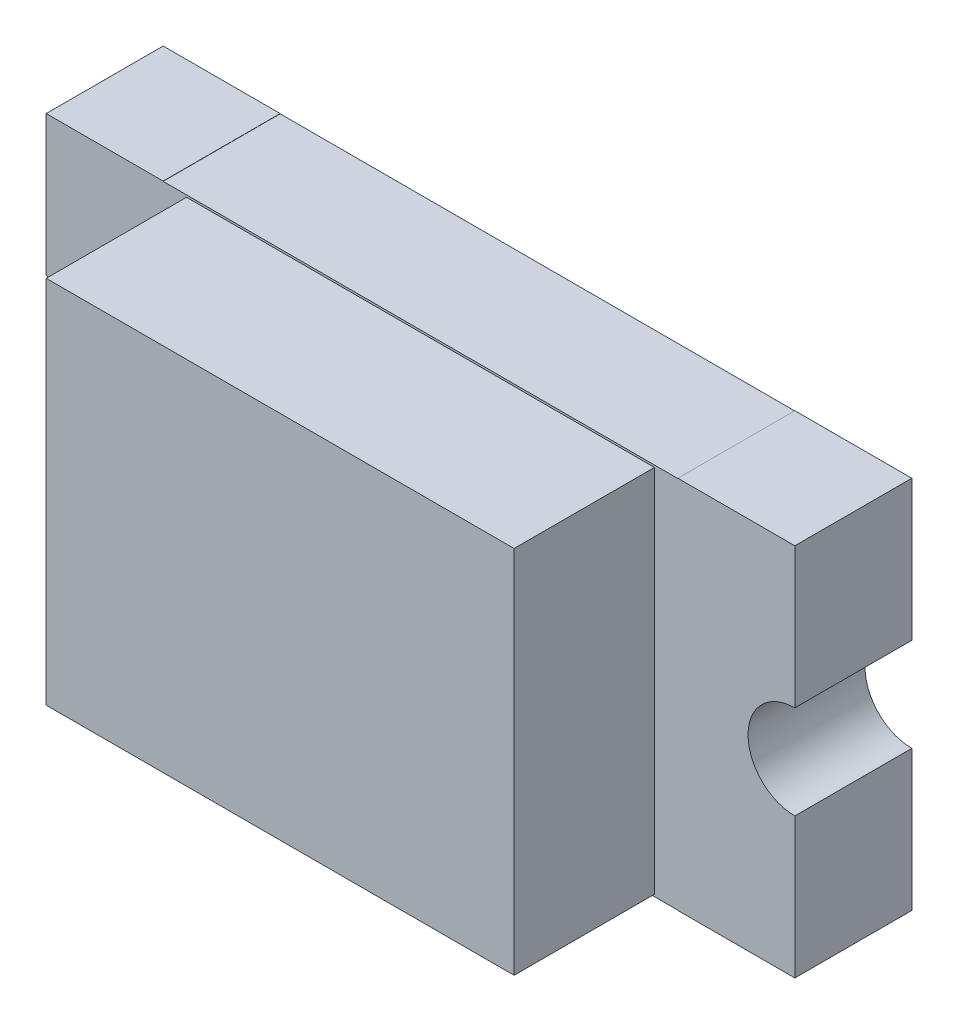
ISO-10303-21;
HEADER;
FILE_DESCRIPTION(('STEP AP214'),'2;1');
FILE_NAME('part.step','',(''),(''),'','','');
FILE_SCHEMA(('AUTOMOTIVE_DESIGN { 1 0 10303 214 1 1 1 1 }'));
ENDSEC;
DATA;
#1=APPLICATION_CONTEXT('core data for automotive mechanical design processes');
#2=APPLICATION_PROTOCOL_DEFINITION('international standard','automotive_design',2000,#1);
#3=PRODUCT_CONTEXT('',#1,'mechanical');
#4=PRODUCT('Part','Part','',(#3));
#5=PRODUCT_RELATED_PRODUCT_CATEGORY('part','',(#4));
#6=PRODUCT_DEFINITION_FORMATION('','',#4);
#7=PRODUCT_DEFINITION_CONTEXT('part definition',#1,'design');
#8=PRODUCT_DEFINITION('design','',#6,#7);
#9=PRODUCT_DEFINITION_SHAPE('','',#8);
#10=(LENGTH_UNIT() NAMED_UNIT(*) SI_UNIT(.MILLI.,.METRE.));
#11=(NAMED_UNIT(*) PLANE_ANGLE_UNIT() SI_UNIT($,.RADIAN.));
#12=(NAMED_UNIT(*) SI_UNIT($,.STERADIAN.) SOLID_ANGLE_UNIT());
#13=UNCERTAINTY_MEASURE_WITH_UNIT(LENGTH_MEASURE(1.E-05),#10,'distance_accuracy_value','');
#14=(GEOMETRIC_REPRESENTATION_CONTEXT(3) GLOBAL_UNCERTAINTY_ASSIGNED_CONTEXT((#13)) GLOBAL_UNIT_ASSIGNED_CONTEXT((#10,
#11,#12)) REPRESENTATION_CONTEXT('',''));
#15=CARTESIAN_POINT('',(0.,0.,0.));
#16=DIRECTION('',(0.,0.,1.));
#17=DIRECTION('',(1.,0.,0.));
#18=AXIS2_PLACEMENT_3D('',#15,#16,#17);
#19=CARTESIAN_POINT('',(0.,0.,1.1));
#20=DIRECTION('',(0.,0.,1.));
#21=DIRECTION('',(1.,0.,0.));
#22=AXIS2_PLACEMENT_3D('',#19,#20,#21);
#23=PLANE('',#22);
#24=DIRECTION('',(1.,0.,0.));
#25=VECTOR('',#24,1.);
#26=CARTESIAN_POINT('',(1.,0.79,1.1));
#27=LINE('',#26,#25);
#28=CARTESIAN_POINT('',(1.,0.79,1.1));
#29=VERTEX_POINT('',#28);
#30=CARTESIAN_POINT('',(-1.,0.79,1.1));
#31=VERTEX_POINT('',#30);
#32=EDGE_CURVE('E159',#29,#31,#27,.F.);
#33=ORIENTED_EDGE('',*,*,#32,.T.);
#34=DIRECTION('',(0.,1.,0.));
#35=VECTOR('',#34,1.);
#36=CARTESIAN_POINT('',(-1.,-0.79,1.1));
#37=LINE('',#36,#35);
#38=CARTESIAN_POINT('',(-1.,-0.79,1.1));
#39=VERTEX_POINT('',#38);
#40=EDGE_CURVE('E138',#31,#39,#37,.F.);
#41=ORIENTED_EDGE('',*,*,#40,.T.);
#42=DIRECTION('',(-1.,0.,0.));
#43=VECTOR('',#42,1.);
#44=CARTESIAN_POINT('',(-1.,-0.79,1.1));
#45=LINE('',#44,#43);
#46=CARTESIAN_POINT('',(1.,-0.79,1.1));
#47=VERTEX_POINT('',#46);
#48=EDGE_CURVE('E145',#39,#47,#45,.F.);
#49=ORIENTED_EDGE('',*,*,#48,.T.);
#50=DIRECTION('',(0.,1.,0.));
#51=VECTOR('',#50,1.);
#52=CARTESIAN_POINT('',(1.,0.,1.1));
#53=LINE('',#52,#51);
#54=EDGE_CURVE('E154',#47,#29,#53,.T.);
#55=ORIENTED_EDGE('',*,*,#54,.T.);
#56=EDGE_LOOP('',(#33,#41,#49,#55));
#57=FACE_BOUND('',#56,.T.);
#58=ADVANCED_FACE('F17',(#57),#23,.T.);
#59=CARTESIAN_POINT('',(-1.,-0.79,1.1));
#60=DIRECTION('',(0.,1.,0.));
#61=DIRECTION('',(-1.,0.,0.));
#62=AXIS2_PLACEMENT_3D('',#59,#60,#61);
#63=PLANE('',#62);
#64=ORIENTED_EDGE('',*,*,#48,.F.);
#65=DIRECTION('',(0.,0.,1.));
#66=VECTOR('',#65,1.);
#67=CARTESIAN_POINT('',(-1.,-0.79,1.1));
#68=LINE('',#67,#66);
#69=CARTESIAN_POINT('',(-1.,-0.79,0.5));
#70=VERTEX_POINT('',#69);
#71=EDGE_CURVE('E149',#39,#70,#68,.F.);
#72=ORIENTED_EDGE('',*,*,#71,.T.);
#73=DIRECTION('',(1.,0.,0.));
#74=VECTOR('',#73,1.);
#75=CARTESIAN_POINT('',(0.,-0.79,0.5));
#76=LINE('',#75,#74);
#77=CARTESIAN_POINT('',(1.,-0.79,0.5));
#78=VERTEX_POINT('',#77);
#79=EDGE_CURVE('E234',#78,#70,#76,.F.);
#80=ORIENTED_EDGE('',*,*,#79,.F.);
#81=DIRECTION('',(0.,0.,1.));
#82=VECTOR('',#81,1.);
#83=CARTESIAN_POINT('',(1.,-0.79,1.1));
#84=LINE('',#83,#82);
#85=EDGE_CURVE('E152',#78,#47,#84,.T.);
#86=ORIENTED_EDGE('',*,*,#85,.T.);
#87=EDGE_LOOP('',(#64,#72,#80,#86));
#88=FACE_BOUND('',#87,.T.);
#89=ADVANCED_FACE('F146',(#88),#63,.F.);
#90=CARTESIAN_POINT('',(-1.,-0.79,1.1));
#91=DIRECTION('',(1.,0.,0.));
#92=DIRECTION('',(0.,1.,0.));
#93=AXIS2_PLACEMENT_3D('',#90,#91,#92);
#94=PLANE('',#93);
#95=ORIENTED_EDGE('',*,*,#40,.F.);
#96=DIRECTION('',(0.,0.,1.));
#97=VECTOR('',#96,1.);
#98=CARTESIAN_POINT('',(-1.,0.79,1.1));
#99=LINE('',#98,#97);
#100=CARTESIAN_POINT('',(-1.,0.79,0.5));
#101=VERTEX_POINT('',#100);
#102=EDGE_CURVE('E264',#31,#101,#99,.F.);
#103=ORIENTED_EDGE('',*,*,#102,.T.);
#104=DIRECTION('',(0.,1.,0.));
#105=VECTOR('',#104,1.);
#106=CARTESIAN_POINT('',(-1.,0.,0.5));
#107=LINE('',#106,#105);
#108=EDGE_CURVE('E158',#70,#101,#107,.T.);
#109=ORIENTED_EDGE('',*,*,#108,.F.);
#110=ORIENTED_EDGE('',*,*,#71,.F.);
#111=EDGE_LOOP('',(#95,#103,#109,#110));
#112=FACE_BOUND('',#111,.T.);
#113=ADVANCED_FACE('F156',(#112),#94,.F.);
#114=CARTESIAN_POINT('',(1.,0.79,1.1));
#115=DIRECTION('',(0.,-1.,0.));
#116=DIRECTION('',(1.,0.,0.));
#117=AXIS2_PLACEMENT_3D('',#114,#115,#116);
#118=PLANE('',#117);
#119=ORIENTED_EDGE('',*,*,#32,.F.);
#120=DIRECTION('',(0.,0.,1.));
#121=VECTOR('',#120,1.);
#122=CARTESIAN_POINT('',(1.,0.79,1.1));
#123=LINE('',#122,#121);
#124=CARTESIAN_POINT('',(1.,0.79,0.5));
#125=VERTEX_POINT('',#124);
#126=EDGE_CURVE('E237',#29,#125,#123,.F.);
#127=ORIENTED_EDGE('',*,*,#126,.T.);
#128=DIRECTION('',(1.,0.,0.));
#129=VECTOR('',#128,1.);
#130=CARTESIAN_POINT('',(0.,0.79,0.5));
#131=LINE('',#130,#129);
#132=EDGE_CURVE('E231',#101,#125,#131,.T.);
#133=ORIENTED_EDGE('',*,*,#132,.F.);
#134=ORIENTED_EDGE('',*,*,#102,.F.);
#135=EDGE_LOOP('',(#119,#127,#133,#134));
#136=FACE_BOUND('',#135,.T.);
#137=ADVANCED_FACE('F268',(#136),#118,.F.);
#138=CARTESIAN_POINT('',(1.,0.79,1.1));
#139=DIRECTION('',(-1.,0.,0.));
#140=DIRECTION('',(0.,0.,1.));
#141=AXIS2_PLACEMENT_3D('',#138,#139,#140);
#142=PLANE('',#141);
#143=ORIENTED_EDGE('',*,*,#54,.F.);
#144=ORIENTED_EDGE('',*,*,#85,.F.);
#145=DIRECTION('',(0.,1.,0.));
#146=VECTOR('',#145,1.);
#147=CARTESIAN_POINT('',(1.,0.,0.5));
#148=LINE('',#147,#146);
#149=EDGE_CURVE('E226',#125,#78,#148,.F.);
#150=ORIENTED_EDGE('',*,*,#149,.F.);
#151=ORIENTED_EDGE('',*,*,#126,.F.);
#152=EDGE_LOOP('',(#143,#144,#150,#151));
#153=FACE_BOUND('',#152,.T.);
#154=ADVANCED_FACE('F508',(#153),#142,.F.);
#155=CARTESIAN_POINT('',(0.,0.,0.5));
#156=DIRECTION('',(0.,0.,1.));
#157=DIRECTION('',(1.,0.,0.));
#158=AXIS2_PLACEMENT_3D('',#155,#156,#157);
#159=PLANE('',#158);
#160=DIRECTION('',(0.,1.,0.));
#161=VECTOR('',#160,1.);
#162=CARTESIAN_POINT('',(-1.1,0.,0.5));
#163=LINE('',#162,#161);
#164=CARTESIAN_POINT('',(-1.1,0.799,0.5));
#165=VERTEX_POINT('',#164);
#166=CARTESIAN_POINT('',(-1.1,0.8,0.5));
#167=VERTEX_POINT('',#166);
#168=EDGE_CURVE('E210',#165,#167,#163,.T.);
#169=ORIENTED_EDGE('',*,*,#168,.T.);
#170=DIRECTION('',(1.,0.,0.));
#171=VECTOR('',#170,1.);
#172=CARTESIAN_POINT('',(0.,0.8,0.5));
#173=LINE('',#172,#171);
#174=CARTESIAN_POINT('',(-1.6,0.8,0.5));
#175=VERTEX_POINT('',#174);
#176=EDGE_CURVE('E118',#167,#175,#173,.F.);
#177=ORIENTED_EDGE('',*,*,#176,.T.);
#178=DIRECTION('',(0.,1.,0.));
#179=VECTOR('',#178,1.);
#180=CARTESIAN_POINT('',(-1.6,0.,0.5));
#181=LINE('',#180,#179);
#182=CARTESIAN_POINT('',(-1.6,0.2,0.5));
#183=VERTEX_POINT('',#182);
#184=EDGE_CURVE('E219',#175,#183,#181,.F.);
#185=ORIENTED_EDGE('',*,*,#184,.T.);
#186=CARTESIAN_POINT('',(-1.6,0.,0.5));
#187=DIRECTION('',(0.,0.,1.));
#188=DIRECTION('',(1.,0.,0.));
#189=AXIS2_PLACEMENT_3D('',#186,#187,#188);
#190=CIRCLE('',#189,0.2);
#191=CARTESIAN_POINT('',(-1.6,-0.2,0.5));
#192=VERTEX_POINT('',#191);
#193=EDGE_CURVE('E20',#183,#192,#190,.F.);
#194=ORIENTED_EDGE('',*,*,#193,.T.);
#195=DIRECTION('',(0.,1.,0.));
#196=VECTOR('',#195,1.);
#197=CARTESIAN_POINT('',(-1.6,0.,0.5));
#198=LINE('',#197,#196);
#199=CARTESIAN_POINT('',(-1.6,-0.8,0.5));
#200=VERTEX_POINT('',#199);
#201=EDGE_CURVE('E211',#192,#200,#198,.F.);
#202=ORIENTED_EDGE('',*,*,#201,.T.);
#203=DIRECTION('',(1.,0.,0.));
#204=VECTOR('',#203,1.);
#205=CARTESIAN_POINT('',(-1.6,-0.8,0.5));
#206=LINE('',#205,#204);
#207=CARTESIAN_POINT('',(-1.1,-0.8,0.5));
#208=VERTEX_POINT('',#207);
#209=EDGE_CURVE('E214',#200,#208,#206,.T.);
#210=ORIENTED_EDGE('',*,*,#209,.T.);
#211=DIRECTION('',(0.,1.,0.));
#212=VECTOR('',#211,1.);
#213=CARTESIAN_POINT('',(-1.1,0.,0.5));
#214=LINE('',#213,#212);
#215=CARTESIAN_POINT('',(-1.1,-0.799,0.5));
#216=VERTEX_POINT('',#215);
#217=EDGE_CURVE('E207',#208,#216,#214,.T.);
#218=ORIENTED_EDGE('',*,*,#217,.T.);
#219=DIRECTION('',(-1.,0.,0.));
#220=VECTOR('',#219,1.);
#221=CARTESIAN_POINT('',(1.1,-0.799,0.5));
#222=LINE('',#221,#220);
#223=CARTESIAN_POINT('',(1.1,-0.799,0.5));
#224=VERTEX_POINT('',#223);
#225=EDGE_CURVE('E259',#216,#224,#222,.F.);
#226=ORIENTED_EDGE('',*,*,#225,.T.);
#227=DIRECTION('',(0.,1.,0.));
#228=VECTOR('',#227,1.);
#229=CARTESIAN_POINT('',(1.1,0.,0.5));
#230=LINE('',#229,#228);
#231=CARTESIAN_POINT('',(1.1,-0.8,0.5));
#232=VERTEX_POINT('',#231);
#233=EDGE_CURVE('E202',#224,#232,#230,.F.);
#234=ORIENTED_EDGE('',*,*,#233,.T.);
#235=DIRECTION('',(1.,0.,0.));
#236=VECTOR('',#235,1.);
#237=CARTESIAN_POINT('',(-1.6,-0.8,0.5));
#238=LINE('',#237,#236);
#239=CARTESIAN_POINT('',(1.6,-0.8,0.5));
#240=VERTEX_POINT('',#239);
#241=EDGE_CURVE('E205',#232,#240,#238,.T.);
#242=ORIENTED_EDGE('',*,*,#241,.T.);
#243=DIRECTION('',(0.,-1.,0.));
#244=VECTOR('',#243,1.);
#245=CARTESIAN_POINT('',(1.6,0.8,0.5));
#246=LINE('',#245,#244);
#247=CARTESIAN_POINT('',(1.6,-0.2,0.5));
#248=VERTEX_POINT('',#247);
#249=EDGE_CURVE('E201',#240,#248,#246,.F.);
#250=ORIENTED_EDGE('',*,*,#249,.T.);
#251=CARTESIAN_POINT('',(1.6,0.,0.5));
#252=DIRECTION('',(0.,0.,1.));
#253=DIRECTION('',(1.,0.,0.));
#254=AXIS2_PLACEMENT_3D('',#251,#252,#253);
#255=CIRCLE('',#254,0.2);
#256=CARTESIAN_POINT('',(1.6,0.2,0.5));
#257=VERTEX_POINT('',#256);
#258=EDGE_CURVE('E197',#248,#257,#255,.F.);
#259=ORIENTED_EDGE('',*,*,#258,.T.);
#260=DIRECTION('',(0.,-1.,0.));
#261=VECTOR('',#260,1.);
#262=CARTESIAN_POINT('',(1.6,0.8,0.5));
#263=LINE('',#262,#261);
#264=CARTESIAN_POINT('',(1.6,0.8,0.5));
#265=VERTEX_POINT('',#264);
#266=EDGE_CURVE('E243',#257,#265,#263,.F.);
#267=ORIENTED_EDGE('',*,*,#266,.T.);
#268=DIRECTION('',(1.,0.,0.));
#269=VECTOR('',#268,1.);
#270=CARTESIAN_POINT('',(-1.6,0.8,0.5));
#271=LINE('',#270,#269);
#272=CARTESIAN_POINT('',(1.1,0.8,0.5));
#273=VERTEX_POINT('',#272);
#274=EDGE_CURVE('E238',#265,#273,#271,.F.);
#275=ORIENTED_EDGE('',*,*,#274,.T.);
#276=DIRECTION('',(0.,1.,0.));
#277=VECTOR('',#276,1.);
#278=CARTESIAN_POINT('',(1.1,0.,0.5));
#279=LINE('',#278,#277);
#280=CARTESIAN_POINT('',(1.1,0.799,0.5));
#281=VERTEX_POINT('',#280);
#282=EDGE_CURVE('E192',#273,#281,#279,.F.);
#283=ORIENTED_EDGE('',*,*,#282,.T.);
#284=DIRECTION('',(1.,0.,0.));
#285=VECTOR('',#284,1.);
#286=CARTESIAN_POINT('',(1.1,0.799,0.5));
#287=LINE('',#286,#285);
#288=EDGE_CURVE('E195',#281,#165,#287,.F.);
#289=ORIENTED_EDGE('',*,*,#288,.T.);
#290=EDGE_LOOP('',(#169,#177,#185,#194,#202,#210,#218,#226,#234,#242,#250,#259,#267,#275,#283,#289));
#291=FACE_BOUND('',#290,.T.);
#292=ORIENTED_EDGE('',*,*,#132,.T.);
#293=ORIENTED_EDGE('',*,*,#149,.T.);
#294=ORIENTED_EDGE('',*,*,#79,.T.);
#295=ORIENTED_EDGE('',*,*,#108,.T.);
#296=EDGE_LOOP('',(#292,#293,#294,#295));
#297=FACE_BOUND('',#296,.T.);
#298=ADVANCED_FACE('F272',(#291,#297),#159,.T.);
#299=CARTESIAN_POINT('',(-1.6,-0.8,1.1));
#300=DIRECTION('',(0.,1.,0.));
#301=DIRECTION('',(0.,0.,1.));
#302=AXIS2_PLACEMENT_3D('',#299,#300,#301);
#303=PLANE('',#302);
#304=ORIENTED_EDGE('',*,*,#209,.F.);
#305=DIRECTION('',(0.,0.,1.));
#306=VECTOR('',#305,1.);
#307=CARTESIAN_POINT('',(-1.6,-0.8,1.1));
#308=LINE('',#307,#306);
#309=CARTESIAN_POINT('',(-1.6,-0.8,0.));
#310=VERTEX_POINT('',#309);
#311=EDGE_CURVE('E361',#200,#310,#308,.F.);
#312=ORIENTED_EDGE('',*,*,#311,.T.);
#313=DIRECTION('',(1.,0.,0.));
#314=VECTOR('',#313,1.);
#315=CARTESIAN_POINT('',(0.,-0.8,0.));
#316=LINE('',#315,#314);
#317=CARTESIAN_POINT('',(-1.1,-0.8,0.));
#318=VERTEX_POINT('',#317);
#319=EDGE_CURVE('E191',#310,#318,#316,.T.);
#320=ORIENTED_EDGE('',*,*,#319,.T.);
#321=DIRECTION('',(0.,0.,1.));
#322=VECTOR('',#321,1.);
#323=CARTESIAN_POINT('',(-1.1,-0.8,2.700000227273));
#324=LINE('',#323,#322);
#325=EDGE_CURVE('E209',#318,#208,#324,.T.);
#326=ORIENTED_EDGE('',*,*,#325,.T.);
#327=EDGE_LOOP('',(#304,#312,#320,#326));
#328=FACE_BOUND('',#327,.T.);
#329=ADVANCED_FACE('F394',(#328),#303,.F.);
#330=CARTESIAN_POINT('',(-1.1,-0.799,2.700000227273));
#331=DIRECTION('',(-1.,0.,0.));
#332=DIRECTION('',(0.,0.,1.));
#333=AXIS2_PLACEMENT_3D('',#330,#331,#332);
#334=PLANE('',#333);
#335=DIRECTION('',(0.,0.,1.));
#336=VECTOR('',#335,1.);
#337=CARTESIAN_POINT('',(-1.1,-0.799,2.700000227273));
#338=LINE('',#337,#336);
#339=CARTESIAN_POINT('',(-1.1,-0.799,0.));
#340=VERTEX_POINT('',#339);
#341=EDGE_CURVE('E208',#340,#216,#338,.T.);
#342=ORIENTED_EDGE('',*,*,#341,.T.);
#343=ORIENTED_EDGE('',*,*,#217,.F.);
#344=ORIENTED_EDGE('',*,*,#325,.F.);
#345=DIRECTION('',(0.,1.,0.));
#346=VECTOR('',#345,1.);
#347=CARTESIAN_POINT('',(-1.1,-0.799,0.));
#348=LINE('',#347,#346);
#349=EDGE_CURVE('E188',#318,#340,#348,.T.);
#350=ORIENTED_EDGE('',*,*,#349,.T.);
#351=EDGE_LOOP('',(#342,#343,#344,#350));
#352=FACE_BOUND('',#351,.T.);
#353=ADVANCED_FACE('F398',(#352),#334,.F.);
#354=CARTESIAN_POINT('',(1.1,-0.799,2.700000227273));
#355=DIRECTION('',(0.,1.,0.));
#356=DIRECTION('',(-1.,0.,0.));
#357=AXIS2_PLACEMENT_3D('',#354,#355,#356);
#358=PLANE('',#357);
#359=DIRECTION('',(0.,0.,1.));
#360=VECTOR('',#359,1.);
#361=CARTESIAN_POINT('',(1.1,-0.799,2.700000227273));
#362=LINE('',#361,#360);
#363=CARTESIAN_POINT('',(1.1,-0.799,0.));
#364=VERTEX_POINT('',#363);
#365=EDGE_CURVE('E206',#364,#224,#362,.T.);
#366=ORIENTED_EDGE('',*,*,#365,.T.);
#367=ORIENTED_EDGE('',*,*,#225,.F.);
#368=ORIENTED_EDGE('',*,*,#341,.F.);
#369=DIRECTION('',(1.,0.,0.));
#370=VECTOR('',#369,1.);
#371=CARTESIAN_POINT('',(0.,-0.799,0.));
#372=LINE('',#371,#370);
#373=EDGE_CURVE('E187',#340,#364,#372,.T.);
#374=ORIENTED_EDGE('',*,*,#373,.T.);
#375=EDGE_LOOP('',(#366,#367,#368,#374));
#376=FACE_BOUND('',#375,.T.);
#377=ADVANCED_FACE('F401',(#376),#358,.F.);
#378=CARTESIAN_POINT('',(1.1,-0.799,2.700000227273));
#379=DIRECTION('',(1.,2.168404344971E-13,0.));
#380=DIRECTION('',(-2.168404344971E-13,1.,0.));
#381=AXIS2_PLACEMENT_3D('',#378,#379,#380);
#382=PLANE('',#381);
#383=DIRECTION('',(0.,0.,1.));
#384=VECTOR('',#383,1.);
#385=CARTESIAN_POINT('',(1.1,-0.8,1.1));
#386=LINE('',#385,#384);
#387=CARTESIAN_POINT('',(1.1,-0.8,0.));
#388=VERTEX_POINT('',#387);
#389=EDGE_CURVE('E256',#388,#232,#386,.T.);
#390=ORIENTED_EDGE('',*,*,#389,.T.);
#391=ORIENTED_EDGE('',*,*,#233,.F.);
#392=ORIENTED_EDGE('',*,*,#365,.F.);
#393=DIRECTION('',(-2.168404344971E-13,1.,0.));
#394=VECTOR('',#393,1.);
#395=CARTESIAN_POINT('',(1.1,-0.799,0.));
#396=LINE('',#395,#394);
#397=EDGE_CURVE('E183',#364,#388,#396,.F.);
#398=ORIENTED_EDGE('',*,*,#397,.T.);
#399=EDGE_LOOP('',(#390,#391,#392,#398));
#400=FACE_BOUND('',#399,.T.);
#401=ADVANCED_FACE('F404',(#400),#382,.F.);
#402=CARTESIAN_POINT('',(-1.6,-0.8,1.1));
#403=DIRECTION('',(0.,1.,0.));
#404=DIRECTION('',(0.,0.,1.));
#405=AXIS2_PLACEMENT_3D('',#402,#403,#404);
#406=PLANE('',#405);
#407=DIRECTION('',(1.,0.,0.));
#408=VECTOR('',#407,1.);
#409=CARTESIAN_POINT('',(0.,-0.8,0.));
#410=LINE('',#409,#408);
#411=CARTESIAN_POINT('',(1.6,-0.8,0.));
#412=VERTEX_POINT('',#411);
#413=EDGE_CURVE('E186',#388,#412,#410,.T.);
#414=ORIENTED_EDGE('',*,*,#413,.T.);
#415=DIRECTION('',(0.,0.,1.));
#416=VECTOR('',#415,1.);
#417=CARTESIAN_POINT('',(1.6,-0.8,1.1));
#418=LINE('',#417,#416);
#419=EDGE_CURVE('E251',#412,#240,#418,.T.);
#420=ORIENTED_EDGE('',*,*,#419,.T.);
#421=ORIENTED_EDGE('',*,*,#241,.F.);
#422=ORIENTED_EDGE('',*,*,#389,.F.);
#423=EDGE_LOOP('',(#414,#420,#421,#422));
#424=FACE_BOUND('',#423,.T.);
#425=ADVANCED_FACE('F292',(#424),#406,.F.);
#426=CARTESIAN_POINT('',(1.6,0.8,1.1));
#427=DIRECTION('',(-1.,0.,0.));
#428=DIRECTION('',(0.,-1.,0.));
#429=AXIS2_PLACEMENT_3D('',#426,#427,#428);
#430=PLANE('',#429);
#431=ORIENTED_EDGE('',*,*,#249,.F.);
#432=ORIENTED_EDGE('',*,*,#419,.F.);
#433=DIRECTION('',(0.,1.,0.));
#434=VECTOR('',#433,1.);
#435=CARTESIAN_POINT('',(1.6,0.,0.));
#436=LINE('',#435,#434);
#437=CARTESIAN_POINT('',(1.6,-0.2,0.));
#438=VERTEX_POINT('',#437);
#439=EDGE_CURVE('E182',#412,#438,#436,.T.);
#440=ORIENTED_EDGE('',*,*,#439,.T.);
#441=DIRECTION('',(0.,0.,1.));
#442=VECTOR('',#441,1.);
#443=CARTESIAN_POINT('',(1.6,-0.2,0.));
#444=LINE('',#443,#442);
#445=EDGE_CURVE('E200',#438,#248,#444,.T.);
#446=ORIENTED_EDGE('',*,*,#445,.T.);
#447=EDGE_LOOP('',(#431,#432,#440,#446));
#448=FACE_BOUND('',#447,.T.);
#449=ADVANCED_FACE('F288',(#448),#430,.F.);
#450=CARTESIAN_POINT('',(1.6,0.,0.));
#451=DIRECTION('',(0.,0.,1.));
#452=DIRECTION('',(1.,0.,0.));
#453=AXIS2_PLACEMENT_3D('',#450,#451,#452);
#454=CYLINDRICAL_SURFACE('',#453,0.2);
#455=CARTESIAN_POINT('',(1.6,0.,0.));
#456=DIRECTION('',(0.,0.,1.));
#457=DIRECTION('',(1.,0.,0.));
#458=AXIS2_PLACEMENT_3D('',#455,#456,#457);
#459=CIRCLE('',#458,0.2);
#460=CARTESIAN_POINT('',(1.6,0.2,0.));
#461=VERTEX_POINT('',#460);
#462=EDGE_CURVE('E178',#438,#461,#459,.F.);
#463=ORIENTED_EDGE('',*,*,#462,.T.);
#464=DIRECTION('',(0.,0.,1.));
#465=VECTOR('',#464,1.);
#466=CARTESIAN_POINT('',(1.6,0.2,1.1));
#467=LINE('',#466,#465);
#468=EDGE_CURVE('E246',#461,#257,#467,.T.);
#469=ORIENTED_EDGE('',*,*,#468,.T.);
#470=ORIENTED_EDGE('',*,*,#258,.F.);
#471=ORIENTED_EDGE('',*,*,#445,.F.);
#472=EDGE_LOOP('',(#463,#469,#470,#471));
#473=FACE_BOUND('',#472,.T.);
#474=ADVANCED_FACE('F328',(#473),#454,.F.);
#475=CARTESIAN_POINT('',(1.6,0.8,1.1));
#476=DIRECTION('',(-1.,0.,0.));
#477=DIRECTION('',(0.,-1.,0.));
#478=AXIS2_PLACEMENT_3D('',#475,#476,#477);
#479=PLANE('',#478);
#480=DIRECTION('',(0.,1.,0.));
#481=VECTOR('',#480,1.);
#482=CARTESIAN_POINT('',(1.6,0.,0.));
#483=LINE('',#482,#481);
#484=CARTESIAN_POINT('',(1.6,0.8,0.));
#485=VERTEX_POINT('',#484);
#486=EDGE_CURVE('E181',#461,#485,#483,.T.);
#487=ORIENTED_EDGE('',*,*,#486,.T.);
#488=DIRECTION('',(0.,0.,-1.));
#489=VECTOR('',#488,1.);
#490=CARTESIAN_POINT('',(1.6,0.8,1.1));
#491=LINE('',#490,#489);
#492=EDGE_CURVE('E240',#485,#265,#491,.F.);
#493=ORIENTED_EDGE('',*,*,#492,.T.);
#494=ORIENTED_EDGE('',*,*,#266,.F.);
#495=ORIENTED_EDGE('',*,*,#468,.F.);
#496=EDGE_LOOP('',(#487,#493,#494,#495));
#497=FACE_BOUND('',#496,.T.);
#498=ADVANCED_FACE('F333',(#497),#479,.F.);
#499=CARTESIAN_POINT('',(-1.6,0.8,1.1));
#500=DIRECTION('',(0.,-1.,0.));
#501=DIRECTION('',(0.,0.,-1.));
#502=AXIS2_PLACEMENT_3D('',#499,#500,#501);
#503=PLANE('',#502);
#504=ORIENTED_EDGE('',*,*,#274,.F.);
#505=ORIENTED_EDGE('',*,*,#492,.F.);
#506=DIRECTION('',(1.,0.,0.));
#507=VECTOR('',#506,1.);
#508=CARTESIAN_POINT('',(0.,0.8,0.));
#509=LINE('',#508,#507);
#510=CARTESIAN_POINT('',(1.1,0.8,0.));
#511=VERTEX_POINT('',#510);
#512=EDGE_CURVE('E177',#485,#511,#509,.F.);
#513=ORIENTED_EDGE('',*,*,#512,.T.);
#514=DIRECTION('',(0.,0.,-1.));
#515=VECTOR('',#514,1.);
#516=CARTESIAN_POINT('',(1.1,0.8,2.700000227273));
#517=LINE('',#516,#515);
#518=EDGE_CURVE('E196',#511,#273,#517,.F.);
#519=ORIENTED_EDGE('',*,*,#518,.T.);
#520=EDGE_LOOP('',(#504,#505,#513,#519));
#521=FACE_BOUND('',#520,.T.);
#522=ADVANCED_FACE('F436',(#521),#503,.F.);
#523=CARTESIAN_POINT('',(1.1,0.8,2.700000227273));
#524=DIRECTION('',(1.,0.,0.));
#525=DIRECTION('',(0.,0.,-1.));
#526=AXIS2_PLACEMENT_3D('',#523,#524,#525);
#527=PLANE('',#526);
#528=DIRECTION('',(0.,0.,-1.));
#529=VECTOR('',#528,1.);
#530=CARTESIAN_POINT('',(1.1,0.799,2.700000227273));
#531=LINE('',#530,#529);
#532=CARTESIAN_POINT('',(1.1,0.799,0.));
#533=VERTEX_POINT('',#532);
#534=EDGE_CURVE('E310',#533,#281,#531,.F.);
#535=ORIENTED_EDGE('',*,*,#534,.T.);
#536=ORIENTED_EDGE('',*,*,#282,.F.);
#537=ORIENTED_EDGE('',*,*,#518,.F.);
#538=DIRECTION('',(0.,1.,0.));
#539=VECTOR('',#538,1.);
#540=CARTESIAN_POINT('',(1.1,0.8,0.));
#541=LINE('',#540,#539);
#542=EDGE_CURVE('E174',#511,#533,#541,.F.);
#543=ORIENTED_EDGE('',*,*,#542,.T.);
#544=EDGE_LOOP('',(#535,#536,#537,#543));
#545=FACE_BOUND('',#544,.T.);
#546=ADVANCED_FACE('F432',(#545),#527,.F.);
#547=CARTESIAN_POINT('',(1.1,0.799,2.700000227273));
#548=DIRECTION('',(0.,-1.,0.));
#549=DIRECTION('',(0.,0.,-1.));
#550=AXIS2_PLACEMENT_3D('',#547,#548,#549);
#551=PLANE('',#550);
#552=DIRECTION('',(1.,0.,0.));
#553=VECTOR('',#552,1.);
#554=CARTESIAN_POINT('',(0.,0.799,0.));
#555=LINE('',#554,#553);
#556=CARTESIAN_POINT('',(-1.1,0.799,0.));
#557=VERTEX_POINT('',#556);
#558=EDGE_CURVE('E173',#533,#557,#555,.F.);
#559=ORIENTED_EDGE('',*,*,#558,.T.);
#560=DIRECTION('',(0.,0.,1.));
#561=VECTOR('',#560,1.);
#562=CARTESIAN_POINT('',(-1.1,0.799,2.700000227273));
#563=LINE('',#562,#561);
#564=EDGE_CURVE('E313',#557,#165,#563,.T.);
#565=ORIENTED_EDGE('',*,*,#564,.T.);
#566=ORIENTED_EDGE('',*,*,#288,.F.);
#567=ORIENTED_EDGE('',*,*,#534,.F.);
#568=EDGE_LOOP('',(#559,#565,#566,#567));
#569=FACE_BOUND('',#568,.T.);
#570=ADVANCED_FACE('F429',(#569),#551,.F.);
#571=CARTESIAN_POINT('',(-1.1,0.8,2.700000227273));
#572=DIRECTION('',(-1.,0.,0.));
#573=DIRECTION('',(0.,0.,1.));
#574=AXIS2_PLACEMENT_3D('',#571,#572,#573);
#575=PLANE('',#574);
#576=DIRECTION('',(0.,0.,-1.));
#577=VECTOR('',#576,1.);
#578=CARTESIAN_POINT('',(-1.1,0.8,1.1));
#579=LINE('',#578,#577);
#580=CARTESIAN_POINT('',(-1.1,0.8,0.));
#581=VERTEX_POINT('',#580);
#582=EDGE_CURVE('E317',#581,#167,#579,.F.);
#583=ORIENTED_EDGE('',*,*,#582,.T.);
#584=ORIENTED_EDGE('',*,*,#168,.F.);
#585=ORIENTED_EDGE('',*,*,#564,.F.);
#586=DIRECTION('',(0.,1.,0.));
#587=VECTOR('',#586,1.);
#588=CARTESIAN_POINT('',(-1.1,0.8,0.));
#589=LINE('',#588,#587);
#590=EDGE_CURVE('E169',#557,#581,#589,.T.);
#591=ORIENTED_EDGE('',*,*,#590,.T.);
#592=EDGE_LOOP('',(#583,#584,#585,#591));
#593=FACE_BOUND('',#592,.T.);
#594=ADVANCED_FACE('F373',(#593),#575,.F.);
#595=CARTESIAN_POINT('',(-1.6,0.8,1.1));
#596=DIRECTION('',(0.,-1.,0.));
#597=DIRECTION('',(0.,0.,-1.));
#598=AXIS2_PLACEMENT_3D('',#595,#596,#597);
#599=PLANE('',#598);
#600=DIRECTION('',(1.,0.,0.));
#601=VECTOR('',#600,1.);
#602=CARTESIAN_POINT('',(0.,0.8,0.));
#603=LINE('',#602,#601);
#604=CARTESIAN_POINT('',(-1.6,0.8,0.));
#605=VERTEX_POINT('',#604);
#606=EDGE_CURVE('E172',#581,#605,#603,.F.);
#607=ORIENTED_EDGE('',*,*,#606,.T.);
#608=DIRECTION('',(0.,0.,1.));
#609=VECTOR('',#608,1.);
#610=CARTESIAN_POINT('',(-1.6,0.8,1.1));
#611=LINE('',#610,#609);
#612=EDGE_CURVE('E369',#605,#175,#611,.T.);
#613=ORIENTED_EDGE('',*,*,#612,.T.);
#614=ORIENTED_EDGE('',*,*,#176,.F.);
#615=ORIENTED_EDGE('',*,*,#582,.F.);
#616=EDGE_LOOP('',(#607,#613,#614,#615));
#617=FACE_BOUND('',#616,.T.);
#618=ADVANCED_FACE('F378',(#617),#599,.F.);
#619=CARTESIAN_POINT('',(-1.6,0.8,1.1));
#620=DIRECTION('',(1.,0.,0.));
#621=DIRECTION('',(0.,1.,0.));
#622=AXIS2_PLACEMENT_3D('',#619,#620,#621);
#623=PLANE('',#622);
#624=ORIENTED_EDGE('',*,*,#184,.F.);
#625=ORIENTED_EDGE('',*,*,#612,.F.);
#626=DIRECTION('',(0.,1.,0.));
#627=VECTOR('',#626,1.);
#628=CARTESIAN_POINT('',(-1.6,0.,0.));
#629=LINE('',#628,#627);
#630=CARTESIAN_POINT('',(-1.6,0.2,0.));
#631=VERTEX_POINT('',#630);
#632=EDGE_CURVE('E168',#605,#631,#629,.F.);
#633=ORIENTED_EDGE('',*,*,#632,.T.);
#634=DIRECTION('',(0.,0.,1.));
#635=VECTOR('',#634,1.);
#636=CARTESIAN_POINT('',(-1.6,0.2,0.));
#637=LINE('',#636,#635);
#638=EDGE_CURVE('E364',#631,#183,#637,.T.);
#639=ORIENTED_EDGE('',*,*,#638,.T.);
#640=EDGE_LOOP('',(#624,#625,#633,#639));
#641=FACE_BOUND('',#640,.T.);
#642=ADVANCED_FACE('F384',(#641),#623,.F.);
#643=CARTESIAN_POINT('',(-1.6,0.,0.));
#644=DIRECTION('',(0.,0.,1.));
#645=DIRECTION('',(1.,0.,0.));
#646=AXIS2_PLACEMENT_3D('',#643,#644,#645);
#647=CYLINDRICAL_SURFACE('',#646,0.2);
#648=CARTESIAN_POINT('',(-1.6,0.,0.));
#649=DIRECTION('',(0.,0.,1.));
#650=DIRECTION('',(1.,0.,0.));
#651=AXIS2_PLACEMENT_3D('',#648,#649,#650);
#652=CIRCLE('',#651,0.2);
#653=CARTESIAN_POINT('',(-1.6,-0.2,0.));
#654=VERTEX_POINT('',#653);
#655=EDGE_CURVE('E26',#631,#654,#652,.F.);
#656=ORIENTED_EDGE('',*,*,#655,.T.);
#657=DIRECTION('',(0.,0.,1.));
#658=VECTOR('',#657,1.);
#659=CARTESIAN_POINT('',(-1.6,-0.2,1.1));
#660=LINE('',#659,#658);
#661=EDGE_CURVE('E357',#654,#192,#660,.T.);
#662=ORIENTED_EDGE('',*,*,#661,.T.);
#663=ORIENTED_EDGE('',*,*,#193,.F.);
#664=ORIENTED_EDGE('',*,*,#638,.F.);
#665=EDGE_LOOP('',(#656,#662,#663,#664));
#666=FACE_BOUND('',#665,.T.);
#667=ADVANCED_FACE('F385',(#666),#647,.F.);
#668=CARTESIAN_POINT('',(-1.6,0.8,1.1));
#669=DIRECTION('',(1.,0.,0.));
#670=DIRECTION('',(0.,1.,0.));
#671=AXIS2_PLACEMENT_3D('',#668,#669,#670);
#672=PLANE('',#671);
#673=DIRECTION('',(0.,1.,0.));
#674=VECTOR('',#673,1.);
#675=CARTESIAN_POINT('',(-1.6,0.,0.));
#676=LINE('',#675,#674);
#677=EDGE_CURVE('E11',#654,#310,#676,.F.);
#678=ORIENTED_EDGE('',*,*,#677,.T.);
#679=ORIENTED_EDGE('',*,*,#311,.F.);
#680=ORIENTED_EDGE('',*,*,#201,.F.);
#681=ORIENTED_EDGE('',*,*,#661,.F.);
#682=EDGE_LOOP('',(#678,#679,#680,#681));
#683=FACE_BOUND('',#682,.T.);
#684=ADVANCED_FACE('F390',(#683),#672,.F.);
#685=CARTESIAN_POINT('',(0.,0.,0.));
#686=DIRECTION('',(0.,0.,1.));
#687=DIRECTION('',(1.,0.,0.));
#688=AXIS2_PLACEMENT_3D('',#685,#686,#687);
#689=PLANE('',#688);
#690=ORIENTED_EDGE('',*,*,#677,.F.);
#691=ORIENTED_EDGE('',*,*,#655,.F.);
#692=ORIENTED_EDGE('',*,*,#632,.F.);
#693=ORIENTED_EDGE('',*,*,#606,.F.);
#694=ORIENTED_EDGE('',*,*,#590,.F.);
#695=ORIENTED_EDGE('',*,*,#558,.F.);
#696=ORIENTED_EDGE('',*,*,#542,.F.);
#697=ORIENTED_EDGE('',*,*,#512,.F.);
#698=ORIENTED_EDGE('',*,*,#486,.F.);
#699=ORIENTED_EDGE('',*,*,#462,.F.);
#700=ORIENTED_EDGE('',*,*,#439,.F.);
#701=ORIENTED_EDGE('',*,*,#413,.F.);
#702=ORIENTED_EDGE('',*,*,#397,.F.);
#703=ORIENTED_EDGE('',*,*,#373,.F.);
#704=ORIENTED_EDGE('',*,*,#349,.F.);
#705=ORIENTED_EDGE('',*,*,#319,.F.);
#706=EDGE_LOOP('',(#690,#691,#692,#693,#694,#695,#696,#697,#698,#699,#700,#701,#702,#703,#704,#705));
#707=FACE_BOUND('',#706,.T.);
#708=ADVANCED_FACE('F337',(#707),#689,.F.);
#709=CLOSED_SHELL('',(#58,#89,#113,#137,#154,#298,#329,#353,#377,#401,#425,#449,#474,#498,#522,
#546,#570,#594,#618,#642,#667,#684,#708));
#710=MANIFOLD_SOLID_BREP('B1',#709);
#711=ADVANCED_BREP_SHAPE_REPRESENTATION('',(#18,#710),#14);
#712=SHAPE_DEFINITION_REPRESENTATION(#9,#711);
ENDSEC;
END-ISO-10303-21;
